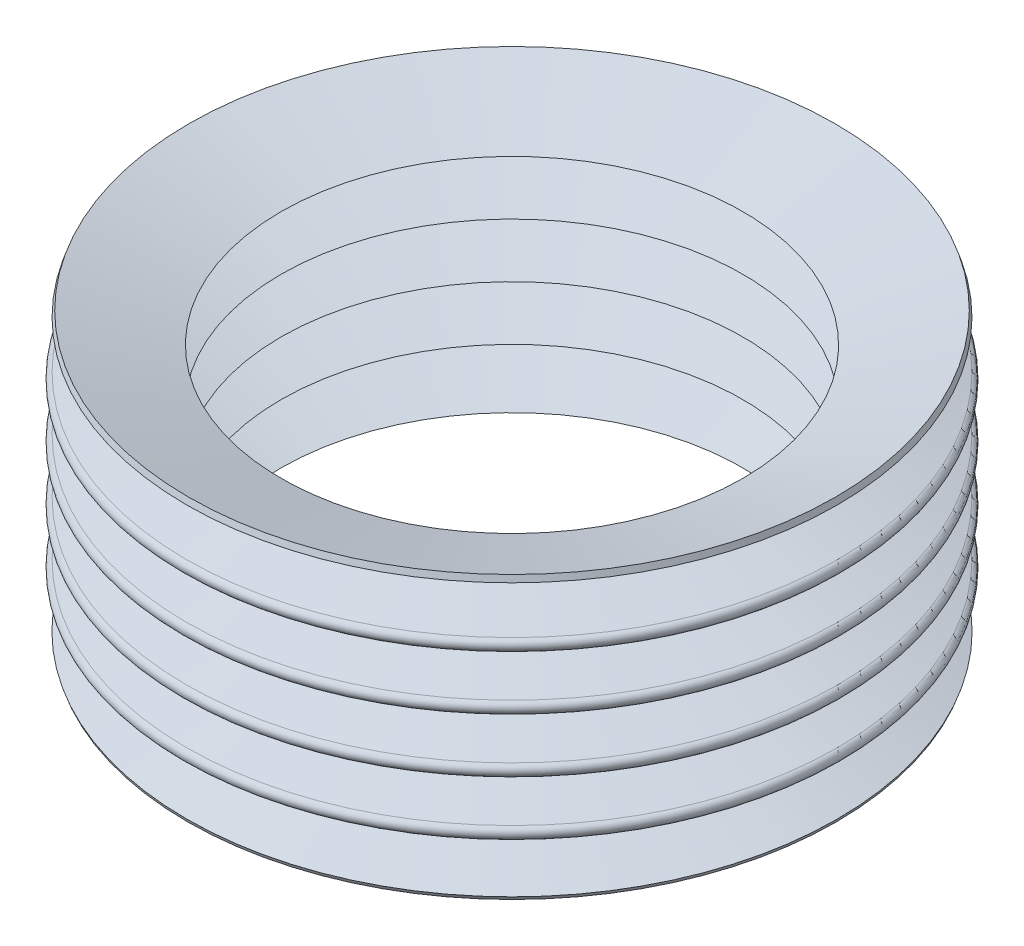
ISO-10303-21;
HEADER;
FILE_DESCRIPTION(('STEP AP214'),'2;1');
FILE_NAME('part.step','',(''),(''),'','','');
FILE_SCHEMA(('AUTOMOTIVE_DESIGN { 1 0 10303 214 1 1 1 1 }'));
ENDSEC;
DATA;
#1=APPLICATION_CONTEXT('core data for automotive mechanical design processes');
#2=APPLICATION_PROTOCOL_DEFINITION('international standard','automotive_design',2000,#1);
#3=PRODUCT_CONTEXT('',#1,'mechanical');
#4=PRODUCT('Part','Part','',(#3));
#5=PRODUCT_RELATED_PRODUCT_CATEGORY('part','',(#4));
#6=PRODUCT_DEFINITION_FORMATION('','',#4);
#7=PRODUCT_DEFINITION_CONTEXT('part definition',#1,'design');
#8=PRODUCT_DEFINITION('design','',#6,#7);
#9=PRODUCT_DEFINITION_SHAPE('','',#8);
#10=(LENGTH_UNIT() NAMED_UNIT(*) SI_UNIT(.MILLI.,.METRE.));
#11=(NAMED_UNIT(*) PLANE_ANGLE_UNIT() SI_UNIT($,.RADIAN.));
#12=(NAMED_UNIT(*) SI_UNIT($,.STERADIAN.) SOLID_ANGLE_UNIT());
#13=UNCERTAINTY_MEASURE_WITH_UNIT(LENGTH_MEASURE(1.E-05),#10,'distance_accuracy_value','');
#14=(GEOMETRIC_REPRESENTATION_CONTEXT(3) GLOBAL_UNCERTAINTY_ASSIGNED_CONTEXT((#13)) GLOBAL_UNIT_ASSIGNED_CONTEXT((#10,
#11,#12)) REPRESENTATION_CONTEXT('',''));
#15=CARTESIAN_POINT('',(0.,0.,0.));
#16=DIRECTION('',(0.,0.,1.));
#17=DIRECTION('',(1.,0.,0.));
#18=AXIS2_PLACEMENT_3D('',#15,#16,#17);
#19=CARTESIAN_POINT('',(0.,7.761904761905,0.));
#20=DIRECTION('',(0.,-1.,0.));
#21=DIRECTION('',(-1.,0.,0.));
#22=AXIS2_PLACEMENT_3D('',#19,#20,#21);
#23=CONICAL_SURFACE('',#22,9.,1.26339885367214);
#24=CARTESIAN_POINT('',(0.,8.238095238095,0.));
#25=DIRECTION('',(0.,-1.,0.));
#26=DIRECTION('',(1.,0.,0.));
#27=AXIS2_PLACEMENT_3D('',#24,#25,#26);
#28=CIRCLE('',#27,7.5);
#29=CARTESIAN_POINT('',(-7.5,8.238095238095,0.));
#30=VERTEX_POINT('',#29);
#31=CARTESIAN_POINT('',(7.50000000000011,8.23809523809533,0.));
#32=VERTEX_POINT('',#31);
#33=EDGE_CURVE('E339',#30,#32,#28,.T.);
#34=ORIENTED_EDGE('',*,*,#33,.F.);
#35=CARTESIAN_POINT('',(0.,8.238095238095,0.));
#36=DIRECTION('',(0.,-1.,0.));
#37=DIRECTION('',(1.,0.,0.));
#38=AXIS2_PLACEMENT_3D('',#35,#36,#37);
#39=CIRCLE('',#38,7.5);
#40=EDGE_CURVE('E305',#32,#30,#39,.T.);
#41=ORIENTED_EDGE('',*,*,#40,.F.);
#42=DIRECTION('',(0.953124267144563,-0.302579132426775,0.));
#43=VECTOR('',#42,1.);
#44=CARTESIAN_POINT('',(9.,7.761904761905,0.));
#45=LINE('',#44,#43);
#46=CARTESIAN_POINT('',(10.5000000000002,7.28571428571458,0.));
#47=VERTEX_POINT('',#46);
#48=EDGE_CURVE('E11',#32,#47,#45,.T.);
#49=ORIENTED_EDGE('',*,*,#48,.T.);
#50=CARTESIAN_POINT('',(0.,7.285714285714,0.));
#51=DIRECTION('',(0.,1.,0.));
#52=DIRECTION('',(1.,0.,0.));
#53=AXIS2_PLACEMENT_3D('',#50,#51,#52);
#54=CIRCLE('',#53,10.5);
#55=CARTESIAN_POINT('',(-10.5,7.285714285714,0.));
#56=VERTEX_POINT('',#55);
#57=EDGE_CURVE('E331',#56,#47,#54,.T.);
#58=ORIENTED_EDGE('',*,*,#57,.F.);
#59=CARTESIAN_POINT('',(0.,7.285714285714,0.));
#60=DIRECTION('',(0.,1.,0.));
#61=DIRECTION('',(1.,0.,0.));
#62=AXIS2_PLACEMENT_3D('',#59,#60,#61);
#63=CIRCLE('',#62,10.5);
#64=EDGE_CURVE('E27',#47,#56,#63,.T.);
#65=ORIENTED_EDGE('',*,*,#64,.F.);
#66=ORIENTED_EDGE('',*,*,#48,.F.);
#67=EDGE_LOOP('',(#34,#41,#49,#58,#65,#66));
#68=FACE_BOUND('',#67,.T.);
#69=ADVANCED_FACE('F17',(#68),#23,.F.);
#70=CARTESIAN_POINT('',(0.,6.880952380952,0.));
#71=DIRECTION('',(0.,1.,0.));
#72=DIRECTION('',(1.,0.,0.));
#73=AXIS2_PLACEMENT_3D('',#70,#71,#72);
#74=CONICAL_SURFACE('',#73,9.,1.30723244321178);
#75=CARTESIAN_POINT('',(0.,6.47619047619,0.));
#76=DIRECTION('',(0.,1.,0.));
#77=DIRECTION('',(1.,0.,0.));
#78=AXIS2_PLACEMENT_3D('',#75,#76,#77);
#79=CIRCLE('',#78,7.5);
#80=CARTESIAN_POINT('',(-7.5,6.47619047619,0.));
#81=VERTEX_POINT('',#80);
#82=CARTESIAN_POINT('',(7.50000000000011,6.47619047619033,0.));
#83=VERTEX_POINT('',#82);
#84=EDGE_CURVE('E333',#81,#83,#79,.T.);
#85=ORIENTED_EDGE('',*,*,#84,.F.);
#86=DIRECTION('',(-0.965467637733895,0.260523013356848,0.));
#87=VECTOR('',#86,1.);
#88=CARTESIAN_POINT('',(-9.,6.880952380952,0.));
#89=LINE('',#88,#87);
#90=EDGE_CURVE('E327',#81,#56,#89,.T.);
#91=ORIENTED_EDGE('',*,*,#90,.T.);
#92=ORIENTED_EDGE('',*,*,#57,.T.);
#93=ORIENTED_EDGE('',*,*,#64,.T.);
#94=ORIENTED_EDGE('',*,*,#90,.F.);
#95=CARTESIAN_POINT('',(0.,6.47619047619,0.));
#96=DIRECTION('',(0.,1.,0.));
#97=DIRECTION('',(1.,0.,0.));
#98=AXIS2_PLACEMENT_3D('',#95,#96,#97);
#99=CIRCLE('',#98,7.5);
#100=EDGE_CURVE('E332',#83,#81,#99,.T.);
#101=ORIENTED_EDGE('',*,*,#100,.F.);
#102=EDGE_LOOP('',(#85,#91,#92,#93,#94,#101));
#103=FACE_BOUND('',#102,.T.);
#104=ADVANCED_FACE('F516',(#103),#74,.F.);
#105=CARTESIAN_POINT('',(0.,6.,0.));
#106=DIRECTION('',(0.,-1.,0.));
#107=DIRECTION('',(-1.,0.,0.));
#108=AXIS2_PLACEMENT_3D('',#105,#106,#107);
#109=CONICAL_SURFACE('',#108,9.,1.26339885367214);
#110=ORIENTED_EDGE('',*,*,#84,.T.);
#111=DIRECTION('',(0.953124267144563,-0.302579132426775,0.));
#112=VECTOR('',#111,1.);
#113=CARTESIAN_POINT('',(9.,6.,0.));
#114=LINE('',#113,#112);
#115=CARTESIAN_POINT('',(10.5,5.52380952380967,0.));
#116=VERTEX_POINT('',#115);
#117=EDGE_CURVE('E337',#83,#116,#114,.T.);
#118=ORIENTED_EDGE('',*,*,#117,.T.);
#119=CARTESIAN_POINT('',(0.,5.52380952381,0.));
#120=DIRECTION('',(0.,1.,0.));
#121=DIRECTION('',(1.,0.,0.));
#122=AXIS2_PLACEMENT_3D('',#119,#120,#121);
#123=CIRCLE('',#122,10.5);
#124=CARTESIAN_POINT('',(-10.5,5.52380952381,0.));
#125=VERTEX_POINT('',#124);
#126=EDGE_CURVE('E362',#125,#116,#123,.T.);
#127=ORIENTED_EDGE('',*,*,#126,.F.);
#128=CARTESIAN_POINT('',(0.,5.52380952381,0.));
#129=DIRECTION('',(0.,1.,0.));
#130=DIRECTION('',(1.,0.,0.));
#131=AXIS2_PLACEMENT_3D('',#128,#129,#130);
#132=CIRCLE('',#131,10.5);
#133=EDGE_CURVE('E338',#116,#125,#132,.T.);
#134=ORIENTED_EDGE('',*,*,#133,.F.);
#135=ORIENTED_EDGE('',*,*,#117,.F.);
#136=ORIENTED_EDGE('',*,*,#100,.T.);
#137=EDGE_LOOP('',(#110,#118,#127,#134,#135,#136));
#138=FACE_BOUND('',#137,.T.);
#139=ADVANCED_FACE('F509',(#138),#109,.F.);
#140=CARTESIAN_POINT('',(0.,5.119047619048,0.));
#141=DIRECTION('',(0.,1.,0.));
#142=DIRECTION('',(1.,0.,0.));
#143=AXIS2_PLACEMENT_3D('',#140,#141,#142);
#144=CONICAL_SURFACE('',#143,9.,1.30723244321178);
#145=CARTESIAN_POINT('',(0.,4.714285714286,0.));
#146=DIRECTION('',(0.,1.,0.));
#147=DIRECTION('',(1.,0.,0.));
#148=AXIS2_PLACEMENT_3D('',#145,#146,#147);
#149=CIRCLE('',#148,7.5);
#150=CARTESIAN_POINT('',(-7.5,4.714285714286,0.));
#151=VERTEX_POINT('',#150);
#152=CARTESIAN_POINT('',(7.49999999999982,4.71428571428542,0.));
#153=VERTEX_POINT('',#152);
#154=EDGE_CURVE('E298',#151,#153,#149,.T.);
#155=ORIENTED_EDGE('',*,*,#154,.F.);
#156=DIRECTION('',(-0.965467637733895,0.260523013356848,0.));
#157=VECTOR('',#156,1.);
#158=CARTESIAN_POINT('',(-9.,5.119047619048,0.));
#159=LINE('',#158,#157);
#160=EDGE_CURVE('E358',#151,#125,#159,.T.);
#161=ORIENTED_EDGE('',*,*,#160,.T.);
#162=ORIENTED_EDGE('',*,*,#126,.T.);
#163=ORIENTED_EDGE('',*,*,#133,.T.);
#164=ORIENTED_EDGE('',*,*,#160,.F.);
#165=CARTESIAN_POINT('',(0.,4.714285714286,0.));
#166=DIRECTION('',(0.,1.,0.));
#167=DIRECTION('',(1.,0.,0.));
#168=AXIS2_PLACEMENT_3D('',#165,#166,#167);
#169=CIRCLE('',#168,7.5);
#170=EDGE_CURVE('E363',#153,#151,#169,.T.);
#171=ORIENTED_EDGE('',*,*,#170,.F.);
#172=EDGE_LOOP('',(#155,#161,#162,#163,#164,#171));
#173=FACE_BOUND('',#172,.T.);
#174=ADVANCED_FACE('F506',(#173),#144,.F.);
#175=CARTESIAN_POINT('',(0.,4.238095238095,0.));
#176=DIRECTION('',(0.,-1.,0.));
#177=DIRECTION('',(-1.,0.,0.));
#178=AXIS2_PLACEMENT_3D('',#175,#176,#177);
#179=CONICAL_SURFACE('',#178,9.,1.26339885367214);
#180=ORIENTED_EDGE('',*,*,#154,.T.);
#181=DIRECTION('',(0.953124267144563,-0.302579132426775,0.));
#182=VECTOR('',#181,1.);
#183=CARTESIAN_POINT('',(9.,4.238095238095,0.));
#184=LINE('',#183,#182);
#185=CARTESIAN_POINT('',(10.5,3.76190476190467,0.));
#186=VERTEX_POINT('',#185);
#187=EDGE_CURVE('E181',#153,#186,#184,.T.);
#188=ORIENTED_EDGE('',*,*,#187,.T.);
#189=CARTESIAN_POINT('',(0.,3.761904761905,0.));
#190=DIRECTION('',(0.,1.,0.));
#191=DIRECTION('',(1.,0.,0.));
#192=AXIS2_PLACEMENT_3D('',#189,#190,#191);
#193=CIRCLE('',#192,10.5);
#194=CARTESIAN_POINT('',(-10.5,3.761904761905,0.));
#195=VERTEX_POINT('',#194);
#196=EDGE_CURVE('E299',#195,#186,#193,.T.);
#197=ORIENTED_EDGE('',*,*,#196,.F.);
#198=CARTESIAN_POINT('',(0.,3.761904761905,0.));
#199=DIRECTION('',(0.,1.,0.));
#200=DIRECTION('',(1.,0.,0.));
#201=AXIS2_PLACEMENT_3D('',#198,#199,#200);
#202=CIRCLE('',#201,10.5);
#203=EDGE_CURVE('E193',#186,#195,#202,.T.);
#204=ORIENTED_EDGE('',*,*,#203,.F.);
#205=ORIENTED_EDGE('',*,*,#187,.F.);
#206=ORIENTED_EDGE('',*,*,#170,.T.);
#207=EDGE_LOOP('',(#180,#188,#197,#204,#205,#206));
#208=FACE_BOUND('',#207,.T.);
#209=ADVANCED_FACE('F568',(#208),#179,.F.);
#210=CARTESIAN_POINT('',(0.,3.357142857143,0.));
#211=DIRECTION('',(0.,1.,0.));
#212=DIRECTION('',(1.,0.,0.));
#213=AXIS2_PLACEMENT_3D('',#210,#211,#212);
#214=CONICAL_SURFACE('',#213,9.,1.30723244321178);
#215=CARTESIAN_POINT('',(0.,2.952380952381,0.));
#216=DIRECTION('',(0.,1.,0.));
#217=DIRECTION('',(1.,0.,0.));
#218=AXIS2_PLACEMENT_3D('',#215,#216,#217);
#219=CIRCLE('',#218,7.5);
#220=CARTESIAN_POINT('',(-7.5,2.952380952381,0.));
#221=VERTEX_POINT('',#220);
#222=CARTESIAN_POINT('',(7.49999999999982,2.95238095238042,0.));
#223=VERTEX_POINT('',#222);
#224=EDGE_CURVE('E376',#221,#223,#219,.T.);
#225=ORIENTED_EDGE('',*,*,#224,.F.);
#226=DIRECTION('',(-0.965467637733895,0.260523013356848,0.));
#227=VECTOR('',#226,1.);
#228=CARTESIAN_POINT('',(-9.,3.357142857143,0.));
#229=LINE('',#228,#227);
#230=EDGE_CURVE('E316',#221,#195,#229,.T.);
#231=ORIENTED_EDGE('',*,*,#230,.T.);
#232=ORIENTED_EDGE('',*,*,#196,.T.);
#233=ORIENTED_EDGE('',*,*,#203,.T.);
#234=ORIENTED_EDGE('',*,*,#230,.F.);
#235=CARTESIAN_POINT('',(0.,2.952380952381,0.));
#236=DIRECTION('',(0.,1.,0.));
#237=DIRECTION('',(1.,0.,0.));
#238=AXIS2_PLACEMENT_3D('',#235,#236,#237);
#239=CIRCLE('',#238,7.5);
#240=EDGE_CURVE('E312',#223,#221,#239,.T.);
#241=ORIENTED_EDGE('',*,*,#240,.F.);
#242=EDGE_LOOP('',(#225,#231,#232,#233,#234,#241));
#243=FACE_BOUND('',#242,.T.);
#244=ADVANCED_FACE('F565',(#243),#214,.F.);
#245=CARTESIAN_POINT('',(0.,2.47619047619,0.));
#246=DIRECTION('',(0.,-1.,0.));
#247=DIRECTION('',(-1.,0.,0.));
#248=AXIS2_PLACEMENT_3D('',#245,#246,#247);
#249=CONICAL_SURFACE('',#248,9.,1.26339885367214);
#250=ORIENTED_EDGE('',*,*,#224,.T.);
#251=DIRECTION('',(0.953124267144563,-0.302579132426775,0.));
#252=VECTOR('',#251,1.);
#253=CARTESIAN_POINT('',(9.,2.47619047619,0.));
#254=LINE('',#253,#252);
#255=CARTESIAN_POINT('',(10.5,1.99999999999967,0.));
#256=VERTEX_POINT('',#255);
#257=EDGE_CURVE('E317',#223,#256,#254,.T.);
#258=ORIENTED_EDGE('',*,*,#257,.T.);
#259=CARTESIAN_POINT('',(0.,2.,0.));
#260=DIRECTION('',(0.,1.,0.));
#261=DIRECTION('',(1.,0.,0.));
#262=AXIS2_PLACEMENT_3D('',#259,#260,#261);
#263=CIRCLE('',#262,10.5);
#264=CARTESIAN_POINT('',(-10.5,2.,0.));
#265=VERTEX_POINT('',#264);
#266=EDGE_CURVE('E250',#265,#256,#263,.T.);
#267=ORIENTED_EDGE('',*,*,#266,.F.);
#268=CARTESIAN_POINT('',(0.,2.,0.));
#269=DIRECTION('',(0.,1.,0.));
#270=DIRECTION('',(1.,0.,0.));
#271=AXIS2_PLACEMENT_3D('',#268,#269,#270);
#272=CIRCLE('',#271,10.5);
#273=EDGE_CURVE('E253',#256,#265,#272,.T.);
#274=ORIENTED_EDGE('',*,*,#273,.F.);
#275=ORIENTED_EDGE('',*,*,#257,.F.);
#276=ORIENTED_EDGE('',*,*,#240,.T.);
#277=EDGE_LOOP('',(#250,#258,#267,#274,#275,#276));
#278=FACE_BOUND('',#277,.T.);
#279=ADVANCED_FACE('F563',(#278),#249,.F.);
#280=CARTESIAN_POINT('',(0.,1.515384615385,0.));
#281=DIRECTION('',(0.,1.,0.));
#282=DIRECTION('',(1.,0.,0.));
#283=AXIS2_PLACEMENT_3D('',#280,#281,#282);
#284=CONICAL_SURFACE('',#283,9.,1.25830476706035);
#285=CARTESIAN_POINT('',(0.,1.030769230769,0.));
#286=DIRECTION('',(0.,1.,0.));
#287=DIRECTION('',(1.,0.,0.));
#288=AXIS2_PLACEMENT_3D('',#285,#286,#287);
#289=CIRCLE('',#288,7.5);
#290=CARTESIAN_POINT('',(-7.5,1.030769230769,0.));
#291=VERTEX_POINT('',#290);
#292=CARTESIAN_POINT('',(7.5,1.03076923076913,0.));
#293=VERTEX_POINT('',#292);
#294=EDGE_CURVE('E256',#291,#293,#289,.T.);
#295=ORIENTED_EDGE('',*,*,#294,.F.);
#296=DIRECTION('',(-0.951570542876951,0.307430483083355,0.));
#297=VECTOR('',#296,1.);
#298=CARTESIAN_POINT('',(-9.,1.515384615385,0.));
#299=LINE('',#298,#297);
#300=EDGE_CURVE('E254',#291,#265,#299,.T.);
#301=ORIENTED_EDGE('',*,*,#300,.T.);
#302=ORIENTED_EDGE('',*,*,#266,.T.);
#303=ORIENTED_EDGE('',*,*,#273,.T.);
#304=ORIENTED_EDGE('',*,*,#300,.F.);
#305=CARTESIAN_POINT('',(0.,1.030769230769,0.));
#306=DIRECTION('',(0.,1.,0.));
#307=DIRECTION('',(1.,0.,0.));
#308=AXIS2_PLACEMENT_3D('',#305,#306,#307);
#309=CIRCLE('',#308,7.5);
#310=EDGE_CURVE('E271',#293,#291,#309,.T.);
#311=ORIENTED_EDGE('',*,*,#310,.F.);
#312=EDGE_LOOP('',(#295,#301,#302,#303,#304,#311));
#313=FACE_BOUND('',#312,.T.);
#314=ADVANCED_FACE('F547',(#313),#284,.F.);
#315=CARTESIAN_POINT('',(0.,0.5603846153846,0.));
#316=DIRECTION('',(0.,-1.,0.));
#317=DIRECTION('',(-1.,0.,0.));
#318=AXIS2_PLACEMENT_3D('',#315,#316,#317);
#319=CONICAL_SURFACE('',#318,8.869029850746,1.23984357816774);
#320=ORIENTED_EDGE('',*,*,#294,.T.);
#321=DIRECTION('',(0.945733182649202,-0.324944221730763,0.));
#322=VECTOR('',#321,1.);
#323=CARTESIAN_POINT('',(8.869029850746,0.5603846153846,0.));
#324=LINE('',#323,#322);
#325=CARTESIAN_POINT('',(10.2380597014902,0.0900000000006674,0.));
#326=VERTEX_POINT('',#325);
#327=EDGE_CURVE('E260',#293,#326,#324,.T.);
#328=ORIENTED_EDGE('',*,*,#327,.T.);
#329=CARTESIAN_POINT('',(0.,0.09,0.));
#330=DIRECTION('',(0.,1.,0.));
#331=DIRECTION('',(1.,0.,0.));
#332=AXIS2_PLACEMENT_3D('',#329,#330,#331);
#333=CIRCLE('',#332,10.23805970149);
#334=EDGE_CURVE('E261',#326,#326,#333,.T.);
#335=ORIENTED_EDGE('',*,*,#334,.F.);
#336=ORIENTED_EDGE('',*,*,#327,.F.);
#337=ORIENTED_EDGE('',*,*,#310,.T.);
#338=EDGE_LOOP('',(#320,#328,#335,#336,#337));
#339=FACE_BOUND('',#338,.T.);
#340=ADVANCED_FACE('F543',(#339),#319,.F.);
#341=CARTESIAN_POINT('',(0.,0.09,0.));
#342=DIRECTION('',(0.,-1.,0.));
#343=DIRECTION('',(0.,0.,-1.));
#344=AXIS2_PLACEMENT_3D('',#341,#342,#343);
#345=PLANE('',#344);
#346=ORIENTED_EDGE('',*,*,#334,.T.);
#347=EDGE_LOOP('',(#346));
#348=FACE_BOUND('',#347,.T.);
#349=CARTESIAN_POINT('',(0.,0.09000000000001,0.));
#350=DIRECTION('',(0.,1.,0.));
#351=DIRECTION('',(1.,0.,0.));
#352=AXIS2_PLACEMENT_3D('',#349,#350,#351);
#353=CIRCLE('',#352,10.53092307692);
#354=CARTESIAN_POINT('',(-10.5309230769186,0.0900000000004793,0.));
#355=VERTEX_POINT('',#354);
#356=EDGE_CURVE('E248',#355,#355,#353,.T.);
#357=ORIENTED_EDGE('',*,*,#356,.F.);
#358=EDGE_LOOP('',(#357));
#359=FACE_BOUND('',#358,.T.);
#360=ADVANCED_FACE('F546',(#348,#359),#345,.T.);
#361=CARTESIAN_POINT('',(0.,0.1395733182649,0.));
#362=DIRECTION('',(0.,1.,0.));
#363=DIRECTION('',(1.,0.,0.));
#364=AXIS2_PLACEMENT_3D('',#361,#362,#363);
#365=CONICAL_SURFACE('',#364,10.54795596063,0.330952748627154);
#366=CARTESIAN_POINT('',(0.,0.1891466365298,0.));
#367=DIRECTION('',(0.,1.,0.));
#368=DIRECTION('',(1.,0.,0.));
#369=AXIS2_PLACEMENT_3D('',#366,#367,#368);
#370=CIRCLE('',#369,10.56498884435);
#371=CARTESIAN_POINT('',(-10.56498884435,0.1891466365298,0.));
#372=VERTEX_POINT('',#371);
#373=CARTESIAN_POINT('',(10.5649888443496,0.189146636528669,0.));
#374=VERTEX_POINT('',#373);
#375=EDGE_CURVE('E224',#372,#374,#370,.T.);
#376=ORIENTED_EDGE('',*,*,#375,.F.);
#377=DIRECTION('',(0.324944221730763,-0.945733182649202,0.));
#378=VECTOR('',#377,1.);
#379=CARTESIAN_POINT('',(-10.54795596063,0.1395733182649,0.));
#380=LINE('',#379,#378);
#381=EDGE_CURVE('E225',#372,#355,#380,.T.);
#382=ORIENTED_EDGE('',*,*,#381,.T.);
#383=ORIENTED_EDGE('',*,*,#356,.T.);
#384=ORIENTED_EDGE('',*,*,#381,.F.);
#385=CARTESIAN_POINT('',(0.,0.1891466365298,0.));
#386=DIRECTION('',(0.,1.,0.));
#387=DIRECTION('',(1.,0.,0.));
#388=AXIS2_PLACEMENT_3D('',#385,#386,#387);
#389=CIRCLE('',#388,10.56498884435);
#390=EDGE_CURVE('E219',#374,#372,#389,.T.);
#391=ORIENTED_EDGE('',*,*,#390,.F.);
#392=EDGE_LOOP('',(#376,#382,#383,#384,#391));
#393=FACE_BOUND('',#392,.T.);
#394=ADVANCED_FACE('F221',(#393),#365,.T.);
#395=CARTESIAN_POINT('',(0.,0.6070387561229,0.));
#396=DIRECTION('',(0.,-1.,0.));
#397=DIRECTION('',(-1.,0.,0.));
#398=AXIS2_PLACEMENT_3D('',#395,#396,#397);
#399=CONICAL_SURFACE('',#398,9.348735660456,1.23984357816774);
#400=ORIENTED_EDGE('',*,*,#375,.T.);
#401=DIRECTION('',(-0.945733182649202,0.324944221730763,0.));
#402=VECTOR('',#401,1.);
#403=CARTESIAN_POINT('',(9.348735660456,0.6070387561229,0.));
#404=LINE('',#403,#402);
#405=CARTESIAN_POINT('',(8.13248247656597,1.0249308757159,0.));
#406=VERTEX_POINT('',#405);
#407=EDGE_CURVE('E228',#374,#406,#404,.T.);
#408=ORIENTED_EDGE('',*,*,#407,.T.);
#409=CARTESIAN_POINT('',(0.,1.024930875716,0.));
#410=DIRECTION('',(0.,1.,0.));
#411=DIRECTION('',(1.,0.,0.));
#412=AXIS2_PLACEMENT_3D('',#409,#410,#411);
#413=CIRCLE('',#412,8.132482476566);
#414=CARTESIAN_POINT('',(-8.132482476566,1.024930875716,0.));
#415=VERTEX_POINT('',#414);
#416=EDGE_CURVE('E244',#415,#406,#413,.T.);
#417=ORIENTED_EDGE('',*,*,#416,.F.);
#418=CARTESIAN_POINT('',(0.,1.024930875716,0.));
#419=DIRECTION('',(0.,1.,0.));
#420=DIRECTION('',(1.,0.,0.));
#421=AXIS2_PLACEMENT_3D('',#418,#419,#420);
#422=CIRCLE('',#421,8.132482476566);
#423=EDGE_CURVE('E234',#406,#415,#422,.T.);
#424=ORIENTED_EDGE('',*,*,#423,.F.);
#425=ORIENTED_EDGE('',*,*,#407,.F.);
#426=ORIENTED_EDGE('',*,*,#390,.T.);
#427=EDGE_LOOP('',(#400,#408,#417,#424,#425,#426));
#428=FACE_BOUND('',#427,.T.);
#429=ADVANCED_FACE('F232',(#428),#399,.T.);
#430=CARTESIAN_POINT('',(0.,1.41730838357,0.));
#431=DIRECTION('',(0.,1.,0.));
#432=DIRECTION('',(1.,0.,0.));
#433=AXIS2_PLACEMENT_3D('',#430,#431,#432);
#434=CONICAL_SURFACE('',#433,9.346984286591,1.25830476706035);
#435=CARTESIAN_POINT('',(0.,1.809685891425,0.));
#436=DIRECTION('',(0.,1.,0.));
#437=DIRECTION('',(-1.,0.,0.));
#438=AXIS2_PLACEMENT_3D('',#435,#436,#437);
#439=CIRCLE('',#438,10.56148609662);
#440=CARTESIAN_POINT('',(10.5613397678708,1.809685891425,0.05559565349486));
#441=VERTEX_POINT('',#440);
#442=CARTESIAN_POINT('',(-10.5614860966198,1.80968589142551,0.));
#443=VERTEX_POINT('',#442);
#444=EDGE_CURVE('E277',#441,#443,#439,.T.);
#445=ORIENTED_EDGE('',*,*,#444,.F.);
#446=CARTESIAN_POINT('',(0.,1.809685891425,0.));
#447=DIRECTION('',(0.,1.,0.));
#448=DIRECTION('',(-1.,0.,0.));
#449=AXIS2_PLACEMENT_3D('',#446,#447,#448);
#450=CIRCLE('',#449,10.56148609662);
#451=EDGE_CURVE('E272',#443,#441,#450,.T.);
#452=ORIENTED_EDGE('',*,*,#451,.F.);
#453=DIRECTION('',(0.951570542876951,-0.307430483083355,0.));
#454=VECTOR('',#453,1.);
#455=CARTESIAN_POINT('',(-9.346984286591,1.41730838357,0.));
#456=LINE('',#455,#454);
#457=EDGE_CURVE('E276',#443,#415,#456,.T.);
#458=ORIENTED_EDGE('',*,*,#457,.T.);
#459=ORIENTED_EDGE('',*,*,#416,.T.);
#460=ORIENTED_EDGE('',*,*,#423,.T.);
#461=ORIENTED_EDGE('',*,*,#457,.F.);
#462=EDGE_LOOP('',(#445,#452,#458,#459,#460,#461));
#463=FACE_BOUND('',#462,.T.);
#464=ADVANCED_FACE('F542',(#463),#434,.T.);
#465=CARTESIAN_POINT('',(0.,2.,0.));
#466=DIRECTION('',(0.,1.,0.));
#467=DIRECTION('',(-0.999986145060664,0.,-0.00526399911776181));
#468=AXIS2_PLACEMENT_3D('',#465,#466,#467);
#469=TOROIDAL_SURFACE('',#468,10.5,0.2);
#470=CARTESIAN_POINT('',(0.,2.190624853429,0.));
#471=DIRECTION('',(0.,1.,0.));
#472=DIRECTION('',(-1.,0.,0.));
#473=AXIS2_PLACEMENT_3D('',#470,#471,#472);
#474=CIRCLE('',#473,10.56051582649);
#475=CARTESIAN_POINT('',(10.5605158264897,2.19062485342805,0.));
#476=VERTEX_POINT('',#475);
#477=CARTESIAN_POINT('',(10.5603695111839,2.190624853429,0.0555905459937517));
#478=VERTEX_POINT('',#477);
#479=EDGE_CURVE('E422',#476,#478,#474,.T.);
#480=ORIENTED_EDGE('',*,*,#479,.F.);
#481=CARTESIAN_POINT('',(0.,2.190624853429,0.));
#482=DIRECTION('',(0.,1.,0.));
#483=DIRECTION('',(-1.,0.,0.));
#484=AXIS2_PLACEMENT_3D('',#481,#482,#483);
#485=CIRCLE('',#484,10.56051582649);
#486=EDGE_CURVE('E357',#478,#476,#485,.T.);
#487=ORIENTED_EDGE('',*,*,#486,.F.);
#488=CARTESIAN_POINT('',(10.499854523137,2.,0.0552719907364977));
#489=DIRECTION('',(0.00526399911776169,0.,-0.999986145060664));
#490=DIRECTION('',(0.999986145060664,0.,0.00526399911776169));
#491=AXIS2_PLACEMENT_3D('',#488,#489,#490);
#492=CIRCLE('',#491,0.2);
#493=EDGE_CURVE('E356',#478,#441,#492,.T.);
#494=ORIENTED_EDGE('',*,*,#493,.T.);
#495=ORIENTED_EDGE('',*,*,#444,.T.);
#496=ORIENTED_EDGE('',*,*,#451,.T.);
#497=ORIENTED_EDGE('',*,*,#493,.F.);
#498=EDGE_LOOP('',(#480,#487,#494,#495,#496,#497));
#499=FACE_BOUND('',#498,.T.);
#500=ADVANCED_FACE('F553',(#499),#469,.T.);
#501=CARTESIAN_POINT('',(0.,2.563721090252,0.));
#502=DIRECTION('',(0.,-1.,0.));
#503=DIRECTION('',(-1.,0.,0.));
#504=AXIS2_PLACEMENT_3D('',#501,#502,#503);
#505=CONICAL_SURFACE('',#504,9.385262680494,1.26339885367214);
#506=ORIENTED_EDGE('',*,*,#479,.T.);
#507=ORIENTED_EDGE('',*,*,#486,.T.);
#508=DIRECTION('',(-0.953124267144563,0.302579132426775,0.));
#509=VECTOR('',#508,1.);
#510=CARTESIAN_POINT('',(9.385262680494,2.563721090252,0.));
#511=LINE('',#510,#509);
#512=CARTESIAN_POINT('',(8.21000953450222,2.9368173270747,0.));
#513=VERTEX_POINT('',#512);
#514=EDGE_CURVE('E353',#476,#513,#511,.T.);
#515=ORIENTED_EDGE('',*,*,#514,.T.);
#516=CARTESIAN_POINT('',(0.,2.936817327074,0.));
#517=DIRECTION('',(0.,1.,0.));
#518=DIRECTION('',(1.,0.,0.));
#519=AXIS2_PLACEMENT_3D('',#516,#517,#518);
#520=CIRCLE('',#519,8.210009534502);
#521=CARTESIAN_POINT('',(-8.210009534502,2.936817327074,0.));
#522=VERTEX_POINT('',#521);
#523=EDGE_CURVE('E408',#522,#513,#520,.T.);
#524=ORIENTED_EDGE('',*,*,#523,.F.);
#525=CARTESIAN_POINT('',(0.,2.936817327074,0.));
#526=DIRECTION('',(0.,1.,0.));
#527=DIRECTION('',(1.,0.,0.));
#528=AXIS2_PLACEMENT_3D('',#525,#526,#527);
#529=CIRCLE('',#528,8.210009534502);
#530=EDGE_CURVE('E435',#513,#522,#529,.T.);
#531=ORIENTED_EDGE('',*,*,#530,.F.);
#532=ORIENTED_EDGE('',*,*,#514,.F.);
#533=EDGE_LOOP('',(#506,#507,#515,#524,#531,#532));
#534=FACE_BOUND('',#533,.T.);
#535=ADVANCED_FACE('F549',(#534),#505,.T.);
#536=CARTESIAN_POINT('',(0.,3.252814280716,0.));
#537=DIRECTION('',(0.,1.,0.));
#538=DIRECTION('',(1.,0.,0.));
#539=AXIS2_PLACEMENT_3D('',#536,#537,#538);
#540=CONICAL_SURFACE('',#539,9.381057068587,1.30723244321178);
#541=CARTESIAN_POINT('',(0.,3.568811234358,0.));
#542=DIRECTION('',(0.,1.,0.));
#543=DIRECTION('',(-1.,0.,0.));
#544=AXIS2_PLACEMENT_3D('',#541,#542,#543);
#545=CIRCLE('',#544,10.55210460267);
#546=CARTESIAN_POINT('',(10.5519603818107,3.568811234358,0.0551692521816115));
#547=VERTEX_POINT('',#546);
#548=CARTESIAN_POINT('',(-10.5521046026701,3.56881123435758,0.));
#549=VERTEX_POINT('',#548);
#550=EDGE_CURVE('E321',#547,#549,#545,.T.);
#551=ORIENTED_EDGE('',*,*,#550,.F.);
#552=CARTESIAN_POINT('',(0.,3.568811234358,0.));
#553=DIRECTION('',(0.,1.,0.));
#554=DIRECTION('',(-1.,0.,0.));
#555=AXIS2_PLACEMENT_3D('',#552,#553,#554);
#556=CIRCLE('',#555,10.55210460267);
#557=EDGE_CURVE('E325',#549,#547,#556,.T.);
#558=ORIENTED_EDGE('',*,*,#557,.F.);
#559=DIRECTION('',(0.965467637733895,-0.260523013356848,0.));
#560=VECTOR('',#559,1.);
#561=CARTESIAN_POINT('',(-9.381057068587,3.252814280716,0.));
#562=LINE('',#561,#560);
#563=EDGE_CURVE('E352',#549,#522,#562,.T.);
#564=ORIENTED_EDGE('',*,*,#563,.T.);
#565=ORIENTED_EDGE('',*,*,#523,.T.);
#566=ORIENTED_EDGE('',*,*,#530,.T.);
#567=ORIENTED_EDGE('',*,*,#563,.F.);
#568=EDGE_LOOP('',(#551,#558,#564,#565,#566,#567));
#569=FACE_BOUND('',#568,.T.);
#570=ADVANCED_FACE('F552',(#569),#540,.T.);
#571=CARTESIAN_POINT('',(0.,3.761904761905,0.));
#572=DIRECTION('',(0.,1.,0.));
#573=DIRECTION('',(-0.999986332502879,0.,-0.00522827002374989));
#574=AXIS2_PLACEMENT_3D('',#571,#572,#573);
#575=TOROIDAL_SURFACE('',#574,10.5,0.2);
#576=CARTESIAN_POINT('',(0.,3.952529615334,0.));
#577=DIRECTION('',(0.,1.,0.));
#578=DIRECTION('',(-1.,0.,0.));
#579=AXIS2_PLACEMENT_3D('',#576,#577,#578);
#580=CIRCLE('',#579,10.56051582649);
#581=CARTESIAN_POINT('',(10.5605158264894,3.95252961533215,0.));
#582=VERTEX_POINT('',#581);
#583=CARTESIAN_POINT('',(10.5603714906703,3.952529615334,0.0552132283309727));
#584=VERTEX_POINT('',#583);
#585=EDGE_CURVE('E290',#582,#584,#580,.T.);
#586=ORIENTED_EDGE('',*,*,#585,.F.);
#587=CARTESIAN_POINT('',(0.,3.952529615334,0.));
#588=DIRECTION('',(0.,1.,0.));
#589=DIRECTION('',(-1.,0.,0.));
#590=AXIS2_PLACEMENT_3D('',#587,#588,#589);
#591=CIRCLE('',#590,10.56051582649);
#592=EDGE_CURVE('E294',#584,#582,#591,.T.);
#593=ORIENTED_EDGE('',*,*,#592,.F.);
#594=CARTESIAN_POINT('',(10.4998564912802,3.761904761905,0.0548968352493726));
#595=DIRECTION('',(0.00522827002374977,0.,-0.999986332502879));
#596=DIRECTION('',(0.999986332502879,0.,0.00522827002374977));
#597=AXIS2_PLACEMENT_3D('',#594,#595,#596);
#598=CIRCLE('',#597,0.2);
#599=EDGE_CURVE('E326',#584,#547,#598,.T.);
#600=ORIENTED_EDGE('',*,*,#599,.T.);
#601=ORIENTED_EDGE('',*,*,#550,.T.);
#602=ORIENTED_EDGE('',*,*,#557,.T.);
#603=ORIENTED_EDGE('',*,*,#599,.F.);
#604=EDGE_LOOP('',(#586,#593,#600,#601,#602,#603));
#605=FACE_BOUND('',#604,.T.);
#606=ADVANCED_FACE('F888',(#605),#575,.T.);
#607=CARTESIAN_POINT('',(0.,4.325625852156,0.));
#608=DIRECTION('',(0.,-1.,0.));
#609=DIRECTION('',(-1.,0.,0.));
#610=AXIS2_PLACEMENT_3D('',#607,#608,#609);
#611=CONICAL_SURFACE('',#610,9.385262680494,1.26339885367214);
#612=ORIENTED_EDGE('',*,*,#585,.T.);
#613=ORIENTED_EDGE('',*,*,#592,.T.);
#614=DIRECTION('',(-0.953124267144563,0.302579132426775,0.));
#615=VECTOR('',#614,1.);
#616=CARTESIAN_POINT('',(9.385262680494,4.325625852156,0.));
#617=LINE('',#616,#615);
#618=CARTESIAN_POINT('',(8.21000953450193,4.69872208897879,0.));
#619=VERTEX_POINT('',#618);
#620=EDGE_CURVE('E346',#582,#619,#617,.T.);
#621=ORIENTED_EDGE('',*,*,#620,.T.);
#622=CARTESIAN_POINT('',(0.,4.698722088979,0.));
#623=DIRECTION('',(0.,1.,0.));
#624=DIRECTION('',(1.,0.,0.));
#625=AXIS2_PLACEMENT_3D('',#622,#623,#624);
#626=CIRCLE('',#625,8.210009534502);
#627=CARTESIAN_POINT('',(-8.210009534502,4.698722088979,0.));
#628=VERTEX_POINT('',#627);
#629=EDGE_CURVE('E266',#628,#619,#626,.T.);
#630=ORIENTED_EDGE('',*,*,#629,.F.);
#631=CARTESIAN_POINT('',(0.,4.698722088979,0.));
#632=DIRECTION('',(0.,1.,0.));
#633=DIRECTION('',(1.,0.,0.));
#634=AXIS2_PLACEMENT_3D('',#631,#632,#633);
#635=CIRCLE('',#634,8.210009534502);
#636=EDGE_CURVE('E295',#619,#628,#635,.T.);
#637=ORIENTED_EDGE('',*,*,#636,.F.);
#638=ORIENTED_EDGE('',*,*,#620,.F.);
#639=EDGE_LOOP('',(#612,#613,#621,#630,#637,#638));
#640=FACE_BOUND('',#639,.T.);
#641=ADVANCED_FACE('F879',(#640),#611,.T.);
#642=CARTESIAN_POINT('',(0.,5.014719042621,0.));
#643=DIRECTION('',(0.,1.,0.));
#644=DIRECTION('',(1.,0.,0.));
#645=AXIS2_PLACEMENT_3D('',#642,#643,#644);
#646=CONICAL_SURFACE('',#645,9.381057068587,1.30723244321178);
#647=CARTESIAN_POINT('',(0.,5.330715996263,0.));
#648=DIRECTION('',(0.,1.,0.));
#649=DIRECTION('',(-1.,0.,0.));
#650=AXIS2_PLACEMENT_3D('',#647,#648,#649);
#651=CIRCLE('',#650,10.55210460267);
#652=CARTESIAN_POINT('',(10.5519603818107,5.330715996263,0.0551692521816115));
#653=VERTEX_POINT('',#652);
#654=CARTESIAN_POINT('',(-10.5521046026701,5.33071599626258,0.));
#655=VERTEX_POINT('',#654);
#656=EDGE_CURVE('E368',#653,#655,#651,.T.);
#657=ORIENTED_EDGE('',*,*,#656,.F.);
#658=CARTESIAN_POINT('',(0.,5.330715996263,0.));
#659=DIRECTION('',(0.,1.,0.));
#660=DIRECTION('',(-1.,0.,0.));
#661=AXIS2_PLACEMENT_3D('',#658,#659,#660);
#662=CIRCLE('',#661,10.55210460267);
#663=EDGE_CURVE('E267',#655,#653,#662,.T.);
#664=ORIENTED_EDGE('',*,*,#663,.F.);
#665=DIRECTION('',(0.965467637733895,-0.260523013356848,0.));
#666=VECTOR('',#665,1.);
#667=CARTESIAN_POINT('',(-9.381057068587,5.014719042621,0.));
#668=LINE('',#667,#666);
#669=EDGE_CURVE('E262',#655,#628,#668,.T.);
#670=ORIENTED_EDGE('',*,*,#669,.T.);
#671=ORIENTED_EDGE('',*,*,#629,.T.);
#672=ORIENTED_EDGE('',*,*,#636,.T.);
#673=ORIENTED_EDGE('',*,*,#669,.F.);
#674=EDGE_LOOP('',(#657,#664,#670,#671,#672,#673));
#675=FACE_BOUND('',#674,.T.);
#676=ADVANCED_FACE('F868',(#675),#646,.T.);
#677=CARTESIAN_POINT('',(0.,5.52380952381,0.));
#678=DIRECTION('',(0.,1.,0.));
#679=DIRECTION('',(-0.999986332502879,0.,-0.00522827002374989));
#680=AXIS2_PLACEMENT_3D('',#677,#678,#679);
#681=TOROIDAL_SURFACE('',#680,10.5,0.2);
#682=CARTESIAN_POINT('',(0.,5.714434377238,0.));
#683=DIRECTION('',(0.,1.,0.));
#684=DIRECTION('',(-1.,0.,0.));
#685=AXIS2_PLACEMENT_3D('',#682,#683,#684);
#686=CIRCLE('',#685,10.56051582649);
#687=CARTESIAN_POINT('',(10.5605158264897,5.71443437723705,0.));
#688=VERTEX_POINT('',#687);
#689=CARTESIAN_POINT('',(10.5603714906703,5.714434377238,0.0552132283309727));
#690=VERTEX_POINT('',#689);
#691=EDGE_CURVE('E375',#688,#690,#686,.T.);
#692=ORIENTED_EDGE('',*,*,#691,.F.);
#693=CARTESIAN_POINT('',(0.,5.714434377238,0.));
#694=DIRECTION('',(0.,1.,0.));
#695=DIRECTION('',(-1.,0.,0.));
#696=AXIS2_PLACEMENT_3D('',#693,#694,#695);
#697=CIRCLE('',#696,10.56051582649);
#698=EDGE_CURVE('E289',#690,#688,#697,.T.);
#699=ORIENTED_EDGE('',*,*,#698,.F.);
#700=CARTESIAN_POINT('',(10.4998564912802,5.52380952381,0.0548968352493726));
#701=DIRECTION('',(0.00522827002374977,0.,-0.999986332502879));
#702=DIRECTION('',(0.999986332502879,0.,0.00522827002374977));
#703=AXIS2_PLACEMENT_3D('',#700,#701,#702);
#704=CIRCLE('',#703,0.2);
#705=EDGE_CURVE('E288',#690,#653,#704,.T.);
#706=ORIENTED_EDGE('',*,*,#705,.T.);
#707=ORIENTED_EDGE('',*,*,#656,.T.);
#708=ORIENTED_EDGE('',*,*,#663,.T.);
#709=ORIENTED_EDGE('',*,*,#705,.F.);
#710=EDGE_LOOP('',(#692,#699,#706,#707,#708,#709));
#711=FACE_BOUND('',#710,.T.);
#712=ADVANCED_FACE('F857',(#711),#681,.T.);
#713=CARTESIAN_POINT('',(0.,6.087530614061,0.));
#714=DIRECTION('',(0.,-1.,0.));
#715=DIRECTION('',(-1.,0.,0.));
#716=AXIS2_PLACEMENT_3D('',#713,#714,#715);
#717=CONICAL_SURFACE('',#716,9.385262680494,1.26339885367214);
#718=ORIENTED_EDGE('',*,*,#691,.T.);
#719=ORIENTED_EDGE('',*,*,#698,.T.);
#720=DIRECTION('',(-0.953124267144563,0.302579132426775,0.));
#721=VECTOR('',#720,1.);
#722=CARTESIAN_POINT('',(9.385262680494,6.087530614061,0.));
#723=LINE('',#722,#721);
#724=CARTESIAN_POINT('',(8.21000953450193,6.46062685088379,0.));
#725=VERTEX_POINT('',#724);
#726=EDGE_CURVE('E284',#688,#725,#723,.T.);
#727=ORIENTED_EDGE('',*,*,#726,.T.);
#728=CARTESIAN_POINT('',(0.,6.460626850884,0.));
#729=DIRECTION('',(0.,1.,0.));
#730=DIRECTION('',(1.,0.,0.));
#731=AXIS2_PLACEMENT_3D('',#728,#729,#730);
#732=CIRCLE('',#731,8.210009534502);
#733=CARTESIAN_POINT('',(-8.210009534502,6.460626850884,0.));
#734=VERTEX_POINT('',#733);
#735=EDGE_CURVE('E390',#734,#725,#732,.T.);
#736=ORIENTED_EDGE('',*,*,#735,.F.);
#737=CARTESIAN_POINT('',(0.,6.460626850884,0.));
#738=DIRECTION('',(0.,1.,0.));
#739=DIRECTION('',(1.,0.,0.));
#740=AXIS2_PLACEMENT_3D('',#737,#738,#739);
#741=CIRCLE('',#740,8.210009534502);
#742=EDGE_CURVE('E387',#725,#734,#741,.T.);
#743=ORIENTED_EDGE('',*,*,#742,.F.);
#744=ORIENTED_EDGE('',*,*,#726,.F.);
#745=EDGE_LOOP('',(#718,#719,#727,#736,#743,#744));
#746=FACE_BOUND('',#745,.T.);
#747=ADVANCED_FACE('F538',(#746),#717,.T.);
#748=CARTESIAN_POINT('',(0.,6.776623804526,0.));
#749=DIRECTION('',(0.,1.,0.));
#750=DIRECTION('',(1.,0.,0.));
#751=AXIS2_PLACEMENT_3D('',#748,#749,#750);
#752=CONICAL_SURFACE('',#751,9.381057068587,1.30723244321178);
#753=CARTESIAN_POINT('',(0.,7.092620758167,0.));
#754=DIRECTION('',(0.,1.,0.));
#755=DIRECTION('',(-1.,0.,0.));
#756=AXIS2_PLACEMENT_3D('',#753,#754,#755);
#757=CIRCLE('',#756,10.55210460267);
#758=CARTESIAN_POINT('',(10.5519603818107,7.092620758167,0.0551692521816115));
#759=VERTEX_POINT('',#758);
#760=CARTESIAN_POINT('',(-10.5521046026699,7.09262075816751,0.));
#761=VERTEX_POINT('',#760);
#762=EDGE_CURVE('E463',#759,#761,#757,.T.);
#763=ORIENTED_EDGE('',*,*,#762,.F.);
#764=CARTESIAN_POINT('',(0.,7.092620758167,0.));
#765=DIRECTION('',(0.,1.,0.));
#766=DIRECTION('',(-1.,0.,0.));
#767=AXIS2_PLACEMENT_3D('',#764,#765,#766);
#768=CIRCLE('',#767,10.55210460267);
#769=EDGE_CURVE('E413',#761,#759,#768,.T.);
#770=ORIENTED_EDGE('',*,*,#769,.F.);
#771=DIRECTION('',(0.965467637733895,-0.260523013356848,0.));
#772=VECTOR('',#771,1.);
#773=CARTESIAN_POINT('',(-9.381057068587,6.776623804526,0.));
#774=LINE('',#773,#772);
#775=EDGE_CURVE('E409',#761,#734,#774,.T.);
#776=ORIENTED_EDGE('',*,*,#775,.T.);
#777=ORIENTED_EDGE('',*,*,#735,.T.);
#778=ORIENTED_EDGE('',*,*,#742,.T.);
#779=ORIENTED_EDGE('',*,*,#775,.F.);
#780=EDGE_LOOP('',(#763,#770,#776,#777,#778,#779));
#781=FACE_BOUND('',#780,.T.);
#782=ADVANCED_FACE('F534',(#781),#752,.T.);
#783=CARTESIAN_POINT('',(0.,7.285714285714,0.));
#784=DIRECTION('',(0.,1.,0.));
#785=DIRECTION('',(-0.999986332502879,0.,-0.00522827002374989));
#786=AXIS2_PLACEMENT_3D('',#783,#784,#785);
#787=TOROIDAL_SURFACE('',#786,10.5,0.2);
#788=CARTESIAN_POINT('',(0.,7.476339139143,0.));
#789=DIRECTION('',(0.,1.,0.));
#790=DIRECTION('',(-1.,0.,0.));
#791=AXIS2_PLACEMENT_3D('',#788,#789,#790);
#792=CIRCLE('',#791,10.56051582649);
#793=CARTESIAN_POINT('',(10.5605158264897,7.47633913914194,0.));
#794=VERTEX_POINT('',#793);
#795=CARTESIAN_POINT('',(10.5603714906703,7.476339139143,0.0552132283309727));
#796=VERTEX_POINT('',#795);
#797=EDGE_CURVE('E278',#794,#796,#792,.T.);
#798=ORIENTED_EDGE('',*,*,#797,.F.);
#799=CARTESIAN_POINT('',(0.,7.476339139143,0.));
#800=DIRECTION('',(0.,1.,0.));
#801=DIRECTION('',(-1.,0.,0.));
#802=AXIS2_PLACEMENT_3D('',#799,#800,#801);
#803=CIRCLE('',#802,10.56051582649);
#804=EDGE_CURVE('E282',#796,#794,#803,.T.);
#805=ORIENTED_EDGE('',*,*,#804,.F.);
#806=CARTESIAN_POINT('',(10.4998564912802,7.285714285714,0.0548968352493726));
#807=DIRECTION('',(0.00522827002374977,0.,-0.999986332502879));
#808=DIRECTION('',(0.999986332502879,0.,0.00522827002374977));
#809=AXIS2_PLACEMENT_3D('',#806,#807,#808);
#810=CIRCLE('',#809,0.2);
#811=EDGE_CURVE('E20',#796,#759,#810,.T.);
#812=ORIENTED_EDGE('',*,*,#811,.T.);
#813=ORIENTED_EDGE('',*,*,#762,.T.);
#814=ORIENTED_EDGE('',*,*,#769,.T.);
#815=ORIENTED_EDGE('',*,*,#811,.F.);
#816=EDGE_LOOP('',(#798,#805,#812,#813,#814,#815));
#817=FACE_BOUND('',#816,.T.);
#818=ADVANCED_FACE('F537',(#817),#787,.T.);
#819=CARTESIAN_POINT('',(0.,7.85805226801,0.));
#820=DIRECTION('',(0.,-1.,0.));
#821=DIRECTION('',(-1.,0.,0.));
#822=AXIS2_PLACEMENT_3D('',#819,#820,#821);
#823=CONICAL_SURFACE('',#822,9.358119470555,1.26339885367214);
#824=ORIENTED_EDGE('',*,*,#797,.T.);
#825=ORIENTED_EDGE('',*,*,#804,.T.);
#826=DIRECTION('',(-0.953124267144563,0.302579132426775,0.));
#827=VECTOR('',#826,1.);
#828=CARTESIAN_POINT('',(9.358119470555,7.85805226801,0.));
#829=LINE('',#828,#827);
#830=CARTESIAN_POINT('',(8.15572311462488,8.23976539687662,0.));
#831=VERTEX_POINT('',#830);
#832=EDGE_CURVE('E439',#794,#831,#829,.T.);
#833=ORIENTED_EDGE('',*,*,#832,.T.);
#834=CARTESIAN_POINT('',(0.,8.239765396877,0.));
#835=DIRECTION('',(0.,1.,0.));
#836=DIRECTION('',(1.,0.,0.));
#837=AXIS2_PLACEMENT_3D('',#834,#835,#836);
#838=CIRCLE('',#837,8.155723114625);
#839=CARTESIAN_POINT('',(-8.155723114625,8.239765396877,0.));
#840=VERTEX_POINT('',#839);
#841=EDGE_CURVE('E367',#840,#831,#838,.T.);
#842=ORIENTED_EDGE('',*,*,#841,.F.);
#843=CARTESIAN_POINT('',(0.,8.239765396877,0.));
#844=DIRECTION('',(0.,1.,0.));
#845=DIRECTION('',(1.,0.,0.));
#846=AXIS2_PLACEMENT_3D('',#843,#844,#845);
#847=CIRCLE('',#846,8.155723114625);
#848=EDGE_CURVE('E283',#831,#840,#847,.T.);
#849=ORIENTED_EDGE('',*,*,#848,.F.);
#850=ORIENTED_EDGE('',*,*,#832,.F.);
#851=EDGE_LOOP('',(#824,#825,#833,#842,#849,#850));
#852=FACE_BOUND('',#851,.T.);
#853=ADVANCED_FACE('F813',(#852),#823,.T.);
#854=CARTESIAN_POINT('',(0.,8.628388647814,0.));
#855=DIRECTION('',(0.,1.,0.));
#856=DIRECTION('',(1.,0.,0.));
#857=AXIS2_PLACEMENT_3D('',#854,#855,#856);
#858=CONICAL_SURFACE('',#857,9.358604605621,1.25830476706035);
#859=CARTESIAN_POINT('',(0.,9.017011898751,0.));
#860=DIRECTION('',(0.,1.,0.));
#861=DIRECTION('',(1.,0.,0.));
#862=AXIS2_PLACEMENT_3D('',#859,#860,#861);
#863=CIRCLE('',#862,10.56148609662);
#864=CARTESIAN_POINT('',(-10.56148609662,9.017011898751,0.));
#865=VERTEX_POINT('',#864);
#866=CARTESIAN_POINT('',(10.5614860966183,9.01701189875045,0.));
#867=VERTEX_POINT('',#866);
#868=EDGE_CURVE('E394',#865,#867,#863,.T.);
#869=ORIENTED_EDGE('',*,*,#868,.F.);
#870=DIRECTION('',(0.951570542876951,-0.307430483083355,0.));
#871=VECTOR('',#870,1.);
#872=CARTESIAN_POINT('',(-9.358604605621,8.628388647814,0.));
#873=LINE('',#872,#871);
#874=EDGE_CURVE('E309',#865,#840,#873,.T.);
#875=ORIENTED_EDGE('',*,*,#874,.T.);
#876=ORIENTED_EDGE('',*,*,#841,.T.);
#877=ORIENTED_EDGE('',*,*,#848,.T.);
#878=ORIENTED_EDGE('',*,*,#874,.F.);
#879=CARTESIAN_POINT('',(0.,9.017011898751,0.));
#880=DIRECTION('',(0.,1.,0.));
#881=DIRECTION('',(1.,0.,0.));
#882=AXIS2_PLACEMENT_3D('',#879,#880,#881);
#883=CIRCLE('',#882,10.56148609662);
#884=EDGE_CURVE('E306',#867,#865,#883,.T.);
#885=ORIENTED_EDGE('',*,*,#884,.F.);
#886=EDGE_LOOP('',(#869,#875,#876,#877,#878,#885));
#887=FACE_BOUND('',#886,.T.);
#888=ADVANCED_FACE('F532',(#887),#858,.T.);
#889=CARTESIAN_POINT('',(0.,9.112168953038,0.));
#890=DIRECTION('',(0.,-1.,0.));
#891=DIRECTION('',(-1.,0.,0.));
#892=AXIS2_PLACEMENT_3D('',#889,#890,#891);
#893=CONICAL_SURFACE('',#892,10.53074304831,0.312491559734551);
#894=ORIENTED_EDGE('',*,*,#868,.T.);
#895=DIRECTION('',(-0.307430483083356,0.951570542876951,0.));
#896=VECTOR('',#895,1.);
#897=CARTESIAN_POINT('',(10.53074304831,9.112168953038,0.));
#898=LINE('',#897,#896);
#899=CARTESIAN_POINT('',(10.5000000000014,9.20732600732646,0.));
#900=VERTEX_POINT('',#899);
#901=EDGE_CURVE('E310',#867,#900,#898,.T.);
#902=ORIENTED_EDGE('',*,*,#901,.T.);
#903=CARTESIAN_POINT('',(0.,9.207326007326,0.));
#904=DIRECTION('',(0.,1.,0.));
#905=DIRECTION('',(1.,0.,0.));
#906=AXIS2_PLACEMENT_3D('',#903,#904,#905);
#907=CIRCLE('',#906,10.5);
#908=CARTESIAN_POINT('',(-10.5,9.207326007326,0.));
#909=VERTEX_POINT('',#908);
#910=EDGE_CURVE('E304',#909,#900,#907,.T.);
#911=ORIENTED_EDGE('',*,*,#910,.F.);
#912=CARTESIAN_POINT('',(0.,9.207326007326,0.));
#913=DIRECTION('',(0.,1.,0.));
#914=DIRECTION('',(1.,0.,0.));
#915=AXIS2_PLACEMENT_3D('',#912,#913,#914);
#916=CIRCLE('',#915,10.5);
#917=EDGE_CURVE('E391',#900,#909,#916,.T.);
#918=ORIENTED_EDGE('',*,*,#917,.F.);
#919=ORIENTED_EDGE('',*,*,#901,.F.);
#920=ORIENTED_EDGE('',*,*,#884,.T.);
#921=EDGE_LOOP('',(#894,#902,#911,#918,#919,#920));
#922=FACE_BOUND('',#921,.T.);
#923=ADVANCED_FACE('F561',(#922),#893,.T.);
#924=CARTESIAN_POINT('',(0.,8.722710622711,0.));
#925=DIRECTION('',(0.,1.,0.));
#926=DIRECTION('',(1.,0.,0.));
#927=AXIS2_PLACEMENT_3D('',#924,#925,#926);
#928=CONICAL_SURFACE('',#927,9.,1.25830476706035);
#929=ORIENTED_EDGE('',*,*,#33,.T.);
#930=ORIENTED_EDGE('',*,*,#40,.T.);
#931=DIRECTION('',(-0.951570542876951,0.307430483083355,0.));
#932=VECTOR('',#931,1.);
#933=CARTESIAN_POINT('',(-9.,8.722710622711,0.));
#934=LINE('',#933,#932);
#935=EDGE_CURVE('E300',#30,#909,#934,.T.);
#936=ORIENTED_EDGE('',*,*,#935,.T.);
#937=ORIENTED_EDGE('',*,*,#910,.T.);
#938=ORIENTED_EDGE('',*,*,#917,.T.);
#939=ORIENTED_EDGE('',*,*,#935,.F.);
#940=EDGE_LOOP('',(#929,#930,#936,#937,#938,#939));
#941=FACE_BOUND('',#940,.T.);
#942=ADVANCED_FACE('F558',(#941),#928,.F.);
#943=CLOSED_SHELL('',(#69,#104,#139,#174,#209,#244,#279,#314,#340,#360,#394,#429,#464,#500,#535,
#570,#606,#641,#676,#712,#747,#782,#818,#853,#888,#923,#942));
#944=MANIFOLD_SOLID_BREP('B1',#943);
#945=ADVANCED_BREP_SHAPE_REPRESENTATION('',(#18,#944),#14);
#946=SHAPE_DEFINITION_REPRESENTATION(#9,#945);
ENDSEC;
END-ISO-10303-21;
